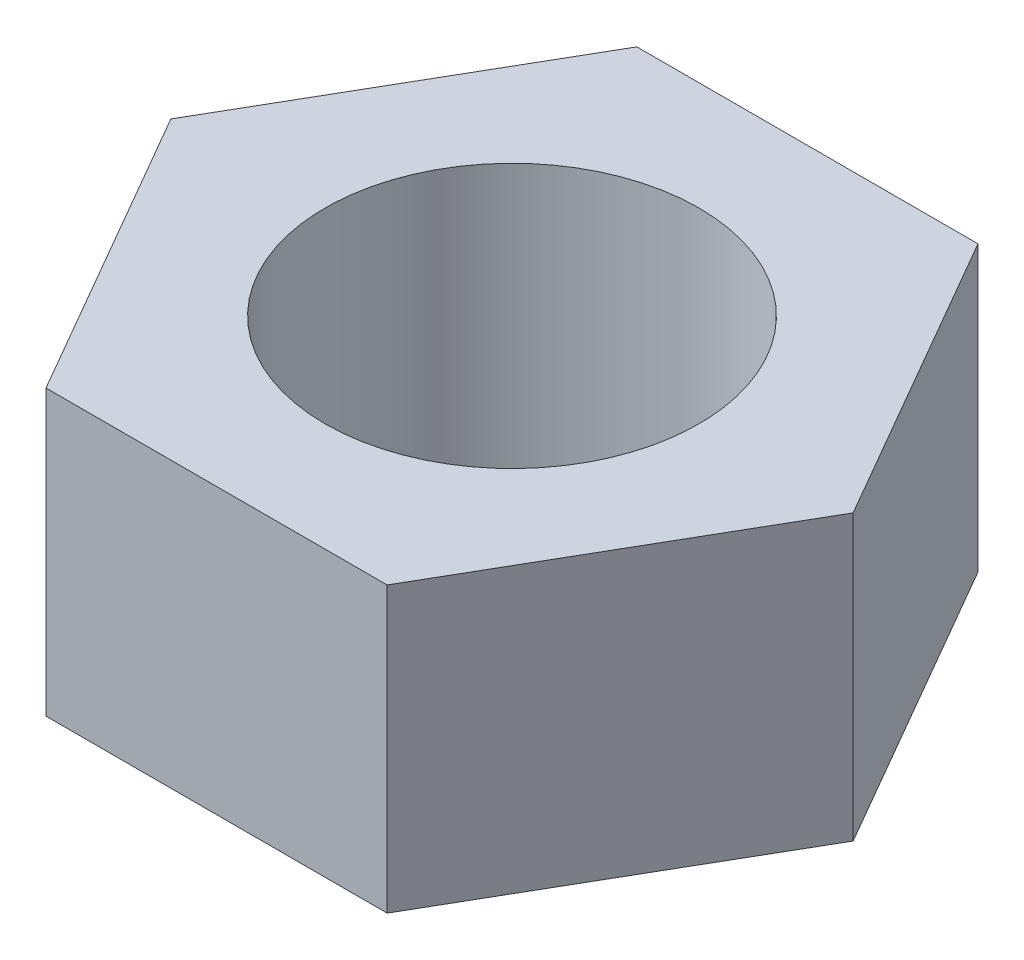
ISO-10303-21;
HEADER;
FILE_DESCRIPTION(('STEP AP214'),'2;1');
FILE_NAME('part.step','',(''),(''),'','','');
FILE_SCHEMA(('AUTOMOTIVE_DESIGN { 1 0 10303 214 1 1 1 1 }'));
ENDSEC;
DATA;
#1=APPLICATION_CONTEXT('core data for automotive mechanical design processes');
#2=APPLICATION_PROTOCOL_DEFINITION('international standard','automotive_design',2000,#1);
#3=PRODUCT_CONTEXT('',#1,'mechanical');
#4=PRODUCT('Part','Part','',(#3));
#5=PRODUCT_RELATED_PRODUCT_CATEGORY('part','',(#4));
#6=PRODUCT_DEFINITION_FORMATION('','',#4);
#7=PRODUCT_DEFINITION_CONTEXT('part definition',#1,'design');
#8=PRODUCT_DEFINITION('design','',#6,#7);
#9=PRODUCT_DEFINITION_SHAPE('','',#8);
#10=(LENGTH_UNIT() NAMED_UNIT(*) SI_UNIT(.MILLI.,.METRE.));
#11=(NAMED_UNIT(*) PLANE_ANGLE_UNIT() SI_UNIT($,.RADIAN.));
#12=(NAMED_UNIT(*) SI_UNIT($,.STERADIAN.) SOLID_ANGLE_UNIT());
#13=UNCERTAINTY_MEASURE_WITH_UNIT(LENGTH_MEASURE(1.E-05),#10,'distance_accuracy_value','');
#14=(GEOMETRIC_REPRESENTATION_CONTEXT(3) GLOBAL_UNCERTAINTY_ASSIGNED_CONTEXT((#13)) GLOBAL_UNIT_ASSIGNED_CONTEXT((#10,
#11,#12)) REPRESENTATION_CONTEXT('',''));
#15=CARTESIAN_POINT('',(0.,0.,0.));
#16=DIRECTION('',(0.,0.,1.));
#17=DIRECTION('',(1.,0.,0.));
#18=AXIS2_PLACEMENT_3D('',#15,#16,#17);
#19=CARTESIAN_POINT('',(0.,3.8,0.));
#20=DIRECTION('',(0.,1.,0.));
#21=DIRECTION('',(0.,0.,1.));
#22=AXIS2_PLACEMENT_3D('',#19,#20,#21);
#23=PLANE('',#22);
#24=DIRECTION('',(1.,0.,0.));
#25=VECTOR('',#24,1.);
#26=CARTESIAN_POINT('',(-2.28053356329902,3.8,3.95));
#27=LINE('',#26,#25);
#28=CARTESIAN_POINT('',(-2.28053356329902,3.8,3.95));
#29=VERTEX_POINT('',#28);
#30=CARTESIAN_POINT('',(2.28053356329902,3.8,3.95));
#31=VERTEX_POINT('',#30);
#32=EDGE_CURVE('E129',#29,#31,#27,.T.);
#33=ORIENTED_EDGE('',*,*,#32,.T.);
#34=DIRECTION('',(0.5,0.,-0.866025403784439));
#35=VECTOR('',#34,1.);
#36=CARTESIAN_POINT('',(2.28053356329902,3.8,3.95));
#37=LINE('',#36,#35);
#38=CARTESIAN_POINT('',(4.56106712659804,3.8,0.));
#39=VERTEX_POINT('',#38);
#40=EDGE_CURVE('E87',#31,#39,#37,.T.);
#41=ORIENTED_EDGE('',*,*,#40,.T.);
#42=DIRECTION('',(-0.500000000000001,0.,-0.866025403784438));
#43=VECTOR('',#42,1.);
#44=CARTESIAN_POINT('',(4.56106712659804,3.8,0.));
#45=LINE('',#44,#43);
#46=CARTESIAN_POINT('',(2.28053356329902,3.8,-3.95));
#47=VERTEX_POINT('',#46);
#48=EDGE_CURVE('E100',#39,#47,#45,.T.);
#49=ORIENTED_EDGE('',*,*,#48,.T.);
#50=DIRECTION('',(-1.,0.,0.));
#51=VECTOR('',#50,1.);
#52=CARTESIAN_POINT('',(2.28053356329902,3.8,-3.95));
#53=LINE('',#52,#51);
#54=CARTESIAN_POINT('',(-2.28053356329902,3.8,-3.95));
#55=VERTEX_POINT('',#54);
#56=EDGE_CURVE('E94',#47,#55,#53,.T.);
#57=ORIENTED_EDGE('',*,*,#56,.T.);
#58=DIRECTION('',(-0.5,0.,0.866025403784439));
#59=VECTOR('',#58,1.);
#60=CARTESIAN_POINT('',(-2.28053356329902,3.8,-3.95));
#61=LINE('',#60,#59);
#62=CARTESIAN_POINT('',(-4.56106712659804,3.8,0.));
#63=VERTEX_POINT('',#62);
#64=EDGE_CURVE('E98',#55,#63,#61,.T.);
#65=ORIENTED_EDGE('',*,*,#64,.T.);
#66=DIRECTION('',(0.5,0.,0.866025403784439));
#67=VECTOR('',#66,1.);
#68=CARTESIAN_POINT('',(-4.56106712659804,3.8,0.));
#69=LINE('',#68,#67);
#70=EDGE_CURVE('E50',#63,#29,#69,.T.);
#71=ORIENTED_EDGE('',*,*,#70,.T.);
#72=EDGE_LOOP('',(#33,#41,#49,#57,#65,#71));
#73=FACE_BOUND('',#72,.T.);
#74=CARTESIAN_POINT('',(0.,3.8,0.));
#75=DIRECTION('',(0.,1.,0.));
#76=DIRECTION('',(0.,0.,1.));
#77=AXIS2_PLACEMENT_3D('',#74,#75,#76);
#78=CIRCLE('',#77,2.5);
#79=CARTESIAN_POINT('',(0.,3.8,-2.5));
#80=VERTEX_POINT('',#79);
#81=EDGE_CURVE('E122',#80,#80,#78,.T.);
#82=ORIENTED_EDGE('',*,*,#81,.F.);
#83=EDGE_LOOP('',(#82));
#84=FACE_BOUND('',#83,.T.);
#85=ADVANCED_FACE('F33',(#73,#84),#23,.T.);
#86=CARTESIAN_POINT('',(0.,0.,0.));
#87=DIRECTION('',(0.,1.,0.));
#88=DIRECTION('',(0.,0.,1.));
#89=AXIS2_PLACEMENT_3D('',#86,#87,#88);
#90=PLANE('',#89);
#91=DIRECTION('',(1.,0.,0.));
#92=VECTOR('',#91,1.);
#93=CARTESIAN_POINT('',(-2.28053356329902,0.,3.95));
#94=LINE('',#93,#92);
#95=CARTESIAN_POINT('',(-2.28053356329902,0.,3.95));
#96=VERTEX_POINT('',#95);
#97=CARTESIAN_POINT('',(2.28053356329902,0.,3.95));
#98=VERTEX_POINT('',#97);
#99=EDGE_CURVE('E118',#96,#98,#94,.T.);
#100=ORIENTED_EDGE('',*,*,#99,.F.);
#101=DIRECTION('',(0.5,0.,0.866025403784439));
#102=VECTOR('',#101,1.);
#103=CARTESIAN_POINT('',(-4.56106712659804,0.,0.));
#104=LINE('',#103,#102);
#105=CARTESIAN_POINT('',(-4.56106712659804,0.,0.));
#106=VERTEX_POINT('',#105);
#107=EDGE_CURVE('E79',#106,#96,#104,.T.);
#108=ORIENTED_EDGE('',*,*,#107,.F.);
#109=DIRECTION('',(-0.5,0.,0.866025403784439));
#110=VECTOR('',#109,1.);
#111=CARTESIAN_POINT('',(-2.28053356329902,0.,-3.95));
#112=LINE('',#111,#110);
#113=CARTESIAN_POINT('',(-2.28053356329902,0.,-3.95));
#114=VERTEX_POINT('',#113);
#115=EDGE_CURVE('E73',#114,#106,#112,.T.);
#116=ORIENTED_EDGE('',*,*,#115,.F.);
#117=DIRECTION('',(-1.,0.,0.));
#118=VECTOR('',#117,1.);
#119=CARTESIAN_POINT('',(2.28053356329902,0.,-3.95));
#120=LINE('',#119,#118);
#121=CARTESIAN_POINT('',(2.28053356329902,0.,-3.95));
#122=VERTEX_POINT('',#121);
#123=EDGE_CURVE('E108',#122,#114,#120,.T.);
#124=ORIENTED_EDGE('',*,*,#123,.F.);
#125=DIRECTION('',(-0.500000000000001,0.,-0.866025403784438));
#126=VECTOR('',#125,1.);
#127=CARTESIAN_POINT('',(4.56106712659804,0.,0.));
#128=LINE('',#127,#126);
#129=CARTESIAN_POINT('',(4.56106712659804,0.,0.));
#130=VERTEX_POINT('',#129);
#131=EDGE_CURVE('E124',#130,#122,#128,.T.);
#132=ORIENTED_EDGE('',*,*,#131,.F.);
#133=DIRECTION('',(0.5,0.,-0.866025403784439));
#134=VECTOR('',#133,1.);
#135=CARTESIAN_POINT('',(2.28053356329902,0.,3.95));
#136=LINE('',#135,#134);
#137=EDGE_CURVE('E121',#98,#130,#136,.T.);
#138=ORIENTED_EDGE('',*,*,#137,.F.);
#139=EDGE_LOOP('',(#100,#108,#116,#124,#132,#138));
#140=FACE_BOUND('',#139,.T.);
#141=CARTESIAN_POINT('',(0.,0.,0.));
#142=DIRECTION('',(0.,1.,0.));
#143=DIRECTION('',(0.,0.,1.));
#144=AXIS2_PLACEMENT_3D('',#141,#142,#143);
#145=CIRCLE('',#144,2.5);
#146=CARTESIAN_POINT('',(0.,0.,-2.5));
#147=VERTEX_POINT('',#146);
#148=EDGE_CURVE('E222',#147,#147,#145,.T.);
#149=ORIENTED_EDGE('',*,*,#148,.T.);
#150=EDGE_LOOP('',(#149));
#151=FACE_BOUND('',#150,.T.);
#152=ADVANCED_FACE('F138',(#140,#151),#90,.F.);
#153=CARTESIAN_POINT('',(-2.28053356329902,3.8,3.95));
#154=DIRECTION('',(0.,0.,-1.));
#155=DIRECTION('',(-1.,0.,0.));
#156=AXIS2_PLACEMENT_3D('',#153,#154,#155);
#157=PLANE('',#156);
#158=ORIENTED_EDGE('',*,*,#99,.T.);
#159=DIRECTION('',(0.,-1.,0.));
#160=VECTOR('',#159,1.);
#161=CARTESIAN_POINT('',(2.28053356329902,3.8,3.95));
#162=LINE('',#161,#160);
#163=EDGE_CURVE('E11',#31,#98,#162,.T.);
#164=ORIENTED_EDGE('',*,*,#163,.F.);
#165=ORIENTED_EDGE('',*,*,#32,.F.);
#166=DIRECTION('',(0.,-1.,0.));
#167=VECTOR('',#166,1.);
#168=CARTESIAN_POINT('',(-2.28053356329902,3.8,3.95));
#169=LINE('',#168,#167);
#170=EDGE_CURVE('E114',#29,#96,#169,.T.);
#171=ORIENTED_EDGE('',*,*,#170,.T.);
#172=EDGE_LOOP('',(#158,#164,#165,#171));
#173=FACE_BOUND('',#172,.T.);
#174=ADVANCED_FACE('F35',(#173),#157,.F.);
#175=CARTESIAN_POINT('',(2.28053356329902,3.8,3.95));
#176=DIRECTION('',(-0.866025403784439,0.,-0.5));
#177=DIRECTION('',(-0.5,0.,0.866025403784439));
#178=AXIS2_PLACEMENT_3D('',#175,#176,#177);
#179=PLANE('',#178);
#180=ORIENTED_EDGE('',*,*,#137,.T.);
#181=DIRECTION('',(0.,-1.,0.));
#182=VECTOR('',#181,1.);
#183=CARTESIAN_POINT('',(4.56106712659804,3.8,0.));
#184=LINE('',#183,#182);
#185=EDGE_CURVE('E42',#39,#130,#184,.T.);
#186=ORIENTED_EDGE('',*,*,#185,.F.);
#187=ORIENTED_EDGE('',*,*,#40,.F.);
#188=ORIENTED_EDGE('',*,*,#163,.T.);
#189=EDGE_LOOP('',(#180,#186,#187,#188));
#190=FACE_BOUND('',#189,.T.);
#191=ADVANCED_FACE('F163',(#190),#179,.F.);
#192=CARTESIAN_POINT('',(4.56106712659804,3.8,0.));
#193=DIRECTION('',(-0.866025403784438,0.,0.500000000000001));
#194=DIRECTION('',(0.500000000000001,0.,0.866025403784438));
#195=AXIS2_PLACEMENT_3D('',#192,#193,#194);
#196=PLANE('',#195);
#197=ORIENTED_EDGE('',*,*,#131,.T.);
#198=DIRECTION('',(0.,-1.,0.));
#199=VECTOR('',#198,1.);
#200=CARTESIAN_POINT('',(2.28053356329902,3.8,-3.95));
#201=LINE('',#200,#199);
#202=EDGE_CURVE('E109',#47,#122,#201,.T.);
#203=ORIENTED_EDGE('',*,*,#202,.F.);
#204=ORIENTED_EDGE('',*,*,#48,.F.);
#205=ORIENTED_EDGE('',*,*,#185,.T.);
#206=EDGE_LOOP('',(#197,#203,#204,#205));
#207=FACE_BOUND('',#206,.T.);
#208=ADVANCED_FACE('F135',(#207),#196,.F.);
#209=CARTESIAN_POINT('',(2.28053356329902,3.8,-3.95));
#210=DIRECTION('',(0.,0.,1.));
#211=DIRECTION('',(1.,0.,0.));
#212=AXIS2_PLACEMENT_3D('',#209,#210,#211);
#213=PLANE('',#212);
#214=ORIENTED_EDGE('',*,*,#123,.T.);
#215=DIRECTION('',(0.,-1.,0.));
#216=VECTOR('',#215,1.);
#217=CARTESIAN_POINT('',(-2.28053356329902,3.8,-3.95));
#218=LINE('',#217,#216);
#219=EDGE_CURVE('E105',#55,#114,#218,.T.);
#220=ORIENTED_EDGE('',*,*,#219,.F.);
#221=ORIENTED_EDGE('',*,*,#56,.F.);
#222=ORIENTED_EDGE('',*,*,#202,.T.);
#223=EDGE_LOOP('',(#214,#220,#221,#222));
#224=FACE_BOUND('',#223,.T.);
#225=ADVANCED_FACE('F106',(#224),#213,.F.);
#226=CARTESIAN_POINT('',(-2.28053356329902,3.8,-3.95));
#227=DIRECTION('',(0.866025403784439,0.,0.5));
#228=DIRECTION('',(0.5,0.,-0.866025403784439));
#229=AXIS2_PLACEMENT_3D('',#226,#227,#228);
#230=PLANE('',#229);
#231=ORIENTED_EDGE('',*,*,#115,.T.);
#232=DIRECTION('',(0.,-1.,0.));
#233=VECTOR('',#232,1.);
#234=CARTESIAN_POINT('',(-4.56106712659804,3.8,0.));
#235=LINE('',#234,#233);
#236=EDGE_CURVE('E110',#63,#106,#235,.T.);
#237=ORIENTED_EDGE('',*,*,#236,.F.);
#238=ORIENTED_EDGE('',*,*,#64,.F.);
#239=ORIENTED_EDGE('',*,*,#219,.T.);
#240=EDGE_LOOP('',(#231,#237,#238,#239));
#241=FACE_BOUND('',#240,.T.);
#242=ADVANCED_FACE('F112',(#241),#230,.F.);
#243=CARTESIAN_POINT('',(-4.56106712659804,3.8,0.));
#244=DIRECTION('',(0.866025403784438,0.,-0.5));
#245=DIRECTION('',(-0.5,0.,-0.866025403784439));
#246=AXIS2_PLACEMENT_3D('',#243,#244,#245);
#247=PLANE('',#246);
#248=ORIENTED_EDGE('',*,*,#107,.T.);
#249=ORIENTED_EDGE('',*,*,#170,.F.);
#250=ORIENTED_EDGE('',*,*,#70,.F.);
#251=ORIENTED_EDGE('',*,*,#236,.T.);
#252=EDGE_LOOP('',(#248,#249,#250,#251));
#253=FACE_BOUND('',#252,.T.);
#254=ADVANCED_FACE('F143',(#253),#247,.F.);
#255=CARTESIAN_POINT('',(0.,3.8,0.));
#256=DIRECTION('',(0.,-1.,0.));
#257=DIRECTION('',(0.,0.,-1.));
#258=AXIS2_PLACEMENT_3D('',#255,#256,#257);
#259=CYLINDRICAL_SURFACE('',#258,2.5);
#260=CARTESIAN_POINT('',(0.,3.8,-2.5));
#261=CARTESIAN_POINT('',(0.,3.76041666666667,-2.5));
#262=CARTESIAN_POINT('',(0.,3.72083333333333,-2.5));
#263=CARTESIAN_POINT('',(0.,3.64166666666667,-2.5));
#264=CARTESIAN_POINT('',(0.,3.60208333333333,-2.5));
#265=CARTESIAN_POINT('',(0.,3.52291666666667,-2.5));
#266=CARTESIAN_POINT('',(0.,3.48333333333333,-2.5));
#267=CARTESIAN_POINT('',(0.,3.40416666666667,-2.5));
#268=CARTESIAN_POINT('',(0.,3.36458333333333,-2.5));
#269=CARTESIAN_POINT('',(0.,3.28541666666667,-2.5));
#270=CARTESIAN_POINT('',(0.,3.24583333333333,-2.5));
#271=CARTESIAN_POINT('',(0.,3.16666666666667,-2.5));
#272=CARTESIAN_POINT('',(0.,3.12708333333333,-2.5));
#273=CARTESIAN_POINT('',(0.,3.04791666666667,-2.5));
#274=CARTESIAN_POINT('',(0.,3.00833333333333,-2.5));
#275=CARTESIAN_POINT('',(0.,2.92916666666667,-2.5));
#276=CARTESIAN_POINT('',(0.,2.88958333333333,-2.5));
#277=CARTESIAN_POINT('',(0.,2.81041666666667,-2.5));
#278=CARTESIAN_POINT('',(0.,2.77083333333333,-2.5));
#279=CARTESIAN_POINT('',(0.,2.69166666666667,-2.5));
#280=CARTESIAN_POINT('',(0.,2.65208333333333,-2.5));
#281=CARTESIAN_POINT('',(0.,2.57291666666667,-2.5));
#282=CARTESIAN_POINT('',(0.,2.53333333333333,-2.5));
#283=CARTESIAN_POINT('',(0.,2.45416666666667,-2.5));
#284=CARTESIAN_POINT('',(0.,2.41458333333333,-2.5));
#285=CARTESIAN_POINT('',(0.,2.33541666666667,-2.5));
#286=CARTESIAN_POINT('',(0.,2.29583333333333,-2.5));
#287=CARTESIAN_POINT('',(0.,2.21666666666667,-2.5));
#288=CARTESIAN_POINT('',(0.,2.17708333333333,-2.5));
#289=CARTESIAN_POINT('',(0.,2.09791666666667,-2.5));
#290=CARTESIAN_POINT('',(0.,2.05833333333333,-2.5));
#291=CARTESIAN_POINT('',(0.,1.97916666666667,-2.5));
#292=CARTESIAN_POINT('',(0.,1.93958333333333,-2.5));
#293=CARTESIAN_POINT('',(0.,1.86041666666667,-2.5));
#294=CARTESIAN_POINT('',(0.,1.82083333333333,-2.5));
#295=CARTESIAN_POINT('',(0.,1.74166666666667,-2.5));
#296=CARTESIAN_POINT('',(0.,1.70208333333333,-2.5));
#297=CARTESIAN_POINT('',(0.,1.62291666666667,-2.5));
#298=CARTESIAN_POINT('',(0.,1.58333333333333,-2.5));
#299=CARTESIAN_POINT('',(0.,1.50416666666667,-2.5));
#300=CARTESIAN_POINT('',(0.,1.46458333333333,-2.5));
#301=CARTESIAN_POINT('',(0.,1.38541666666667,-2.5));
#302=CARTESIAN_POINT('',(0.,1.34583333333333,-2.5));
#303=CARTESIAN_POINT('',(0.,1.26666666666667,-2.5));
#304=CARTESIAN_POINT('',(0.,1.22708333333333,-2.5));
#305=CARTESIAN_POINT('',(0.,1.14791666666667,-2.5));
#306=CARTESIAN_POINT('',(0.,1.10833333333333,-2.5));
#307=CARTESIAN_POINT('',(0.,1.02916666666667,-2.5));
#308=CARTESIAN_POINT('',(0.,0.989583333333334,-2.5));
#309=CARTESIAN_POINT('',(0.,0.910416666666667,-2.5));
#310=CARTESIAN_POINT('',(0.,0.870833333333333,-2.5));
#311=CARTESIAN_POINT('',(0.,0.791666666666667,-2.5));
#312=CARTESIAN_POINT('',(0.,0.752083333333333,-2.5));
#313=CARTESIAN_POINT('',(0.,0.672916666666667,-2.5));
#314=CARTESIAN_POINT('',(0.,0.633333333333333,-2.5));
#315=CARTESIAN_POINT('',(0.,0.554166666666667,-2.5));
#316=CARTESIAN_POINT('',(0.,0.514583333333334,-2.5));
#317=CARTESIAN_POINT('',(0.,0.435416666666667,-2.5));
#318=CARTESIAN_POINT('',(0.,0.395833333333334,-2.5));
#319=CARTESIAN_POINT('',(0.,0.316666666666667,-2.5));
#320=CARTESIAN_POINT('',(0.,0.277083333333333,-2.5));
#321=CARTESIAN_POINT('',(0.,0.197916666666667,-2.5));
#322=CARTESIAN_POINT('',(0.,0.158333333333333,-2.5));
#323=CARTESIAN_POINT('',(0.,0.0791666666666666,-2.5));
#324=CARTESIAN_POINT('',(0.,0.0395833333333333,-2.5));
#325=CARTESIAN_POINT('',(0.,0.,-2.5));
#326=B_SPLINE_CURVE_WITH_KNOTS('',3,(#260,#261,#262,#263,#264,#265,#266,#267,#268,#269,#270,
#271,#272,#273,#274,#275,#276,#277,#278,#279,#280,#281,#282,#283,#284,#285,#286,#287,#288,#289,
#290,#291,#292,#293,#294,#295,#296,#297,#298,#299,#300,#301,#302,#303,#304,#305,#306,#307,#308,
#309,#310,#311,#312,#313,#314,#315,#316,#317,#318,#319,#320,#321,#322,#323,#324,#325),
.UNSPECIFIED.,.F.,.F.,(4,2,2,2,2,2,2,2,2,2,2,2,2,2,2,2,2,2,2,2,2,2,2,2,2,2,2,2,2,2,2,2,4),(0.,
0.11875,0.2375,0.35625,0.475,0.59375,0.7125,0.83125,0.95,1.06875,1.1875,1.30625,1.425,1.54375,
1.6625,1.78125,1.9,2.01875,2.1375,2.25625,2.375,2.49375,2.6125,2.73125,2.85,2.96875,3.0875,
3.20625,3.325,3.44375,3.5625,3.68125,3.8),.UNSPECIFIED.);
#327=EDGE_CURVE('BSEAM145',#80,#147,#326,.T.);
#328=ORIENTED_EDGE('',*,*,#81,.T.);
#329=ORIENTED_EDGE('',*,*,#148,.F.);
#330=ORIENTED_EDGE('',*,*,#327,.T.);
#331=ORIENTED_EDGE('',*,*,#327,.F.);
#332=EDGE_LOOP('',(#328,#330,#329,#331));
#333=FACE_BOUND('',#332,.T.);
#334=ADVANCED_FACE('F145',(#333),#259,.F.);
#335=CLOSED_SHELL('',(#85,#152,#174,#191,#208,#225,#242,#254,#334));
#336=MANIFOLD_SOLID_BREP('B2',#335);
#337=ADVANCED_BREP_SHAPE_REPRESENTATION('',(#18,#336),#14);
#338=SHAPE_DEFINITION_REPRESENTATION(#9,#337);
ENDSEC;
END-ISO-10303-21;
